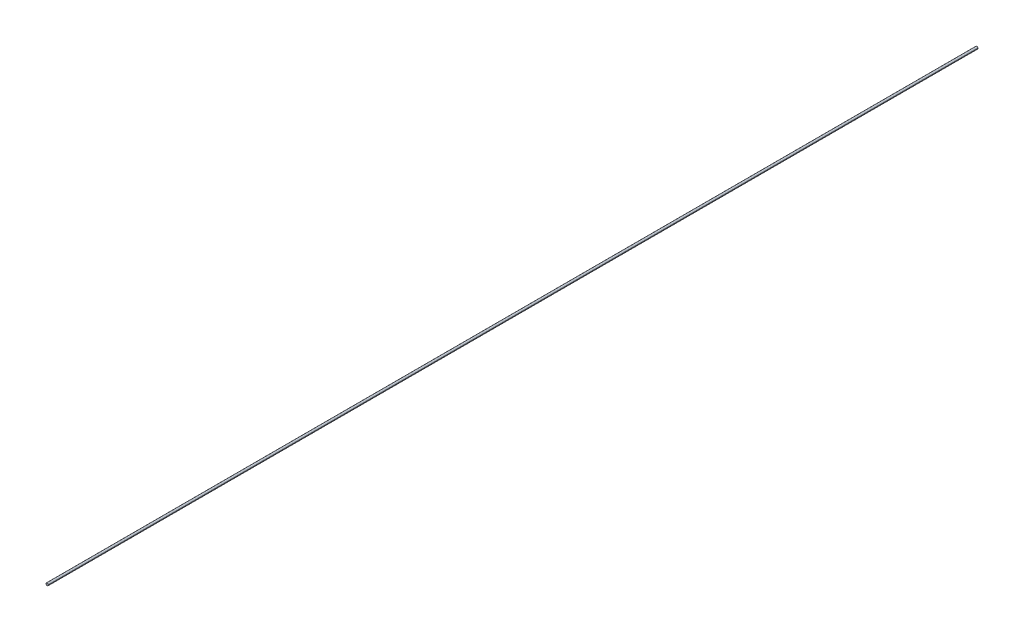
ISO-10303-21;
HEADER;
FILE_DESCRIPTION(('STEP AP214'),'2;1');
FILE_NAME('part.step','',(''),(''),'','','');
FILE_SCHEMA(('AUTOMOTIVE_DESIGN { 1 0 10303 214 1 1 1 1 }'));
ENDSEC;
DATA;
#1=APPLICATION_CONTEXT('core data for automotive mechanical design processes');
#2=APPLICATION_PROTOCOL_DEFINITION('international standard','automotive_design',2000,#1);
#3=PRODUCT_CONTEXT('',#1,'mechanical');
#4=PRODUCT('Part','Part','',(#3));
#5=PRODUCT_RELATED_PRODUCT_CATEGORY('part','',(#4));
#6=PRODUCT_DEFINITION_FORMATION('','',#4);
#7=PRODUCT_DEFINITION_CONTEXT('part definition',#1,'design');
#8=PRODUCT_DEFINITION('design','',#6,#7);
#9=PRODUCT_DEFINITION_SHAPE('','',#8);
#10=(LENGTH_UNIT() NAMED_UNIT(*) SI_UNIT(.MILLI.,.METRE.));
#11=(NAMED_UNIT(*) PLANE_ANGLE_UNIT() SI_UNIT($,.RADIAN.));
#12=(NAMED_UNIT(*) SI_UNIT($,.STERADIAN.) SOLID_ANGLE_UNIT());
#13=UNCERTAINTY_MEASURE_WITH_UNIT(LENGTH_MEASURE(1.E-05),#10,'distance_accuracy_value','');
#14=(GEOMETRIC_REPRESENTATION_CONTEXT(3) GLOBAL_UNCERTAINTY_ASSIGNED_CONTEXT((#13)) GLOBAL_UNIT_ASSIGNED_CONTEXT((#10,
#11,#12)) REPRESENTATION_CONTEXT('',''));
#15=CARTESIAN_POINT('',(0.,0.,0.));
#16=DIRECTION('',(0.,0.,1.));
#17=DIRECTION('',(1.,0.,0.));
#18=AXIS2_PLACEMENT_3D('',#15,#16,#17);
#19=CARTESIAN_POINT('',(0.,0.,15000.));
#20=DIRECTION('',(0.,0.,-1.));
#21=DIRECTION('',(-1.,0.,0.));
#22=AXIS2_PLACEMENT_3D('',#19,#20,#21);
#23=CYLINDRICAL_SURFACE('',#22,19.05);
#24=CARTESIAN_POINT('',(0.,0.,0.));
#25=DIRECTION('',(0.,0.,1.));
#26=DIRECTION('',(1.,0.,0.));
#27=AXIS2_PLACEMENT_3D('',#24,#25,#26);
#28=CIRCLE('',#27,19.05);
#29=CARTESIAN_POINT('',(19.0479994163748,0.276076499879707,0.));
#30=VERTEX_POINT('',#29);
#31=CARTESIAN_POINT('',(-19.0479994163748,0.276076499879707,0.));
#32=VERTEX_POINT('',#31);
#33=EDGE_CURVE('E40',#30,#32,#28,.T.);
#34=ORIENTED_EDGE('',*,*,#33,.T.);
#35=DIRECTION('',(0.,0.,-1.));
#36=VECTOR('',#35,1.);
#37=CARTESIAN_POINT('',(-19.0479994163748,0.276076499879707,15000.));
#38=LINE('',#37,#36);
#39=CARTESIAN_POINT('',(-19.0479994163748,0.276076499879707,15000.));
#40=VERTEX_POINT('',#39);
#41=EDGE_CURVE('E133',#32,#40,#38,.F.);
#42=ORIENTED_EDGE('',*,*,#41,.T.);
#43=CARTESIAN_POINT('',(0.,0.,15000.));
#44=DIRECTION('',(0.,0.,1.));
#45=DIRECTION('',(1.,0.,0.));
#46=AXIS2_PLACEMENT_3D('',#43,#44,#45);
#47=CIRCLE('',#46,19.05);
#48=CARTESIAN_POINT('',(19.0479994163748,0.276076499879707,15000.));
#49=VERTEX_POINT('',#48);
#50=EDGE_CURVE('E11',#49,#40,#47,.T.);
#51=ORIENTED_EDGE('',*,*,#50,.F.);
#52=DIRECTION('',(0.,0.,-1.));
#53=VECTOR('',#52,1.);
#54=CARTESIAN_POINT('',(19.0479994163748,0.276076499879707,15000.));
#55=LINE('',#54,#53);
#56=EDGE_CURVE('E158',#49,#30,#55,.T.);
#57=ORIENTED_EDGE('',*,*,#56,.T.);
#58=EDGE_LOOP('',(#34,#42,#51,#57));
#59=FACE_BOUND('',#58,.T.);
#60=ADVANCED_FACE('F36',(#59),#23,.T.);
#61=CARTESIAN_POINT('',(-19.0479994163748,-0.276076499879707,15000.));
#62=VERTEX_POINT('',#61);
#63=CARTESIAN_POINT('',(19.0479994163748,-0.276076499879707,15000.));
#64=VERTEX_POINT('',#63);
#65=EDGE_CURVE('E45',#62,#64,#47,.T.);
#66=ORIENTED_EDGE('',*,*,#65,.F.);
#67=DIRECTION('',(0.,0.,-1.));
#68=VECTOR('',#67,1.);
#69=CARTESIAN_POINT('',(-19.0479994163748,-0.276076499879707,15000.));
#70=LINE('',#69,#68);
#71=CARTESIAN_POINT('',(-19.0479994163748,-0.276076499879707,0.));
#72=VERTEX_POINT('',#71);
#73=EDGE_CURVE('E131',#62,#72,#70,.T.);
#74=ORIENTED_EDGE('',*,*,#73,.T.);
#75=CARTESIAN_POINT('',(19.0479994163748,-0.276076499879707,0.));
#76=VERTEX_POINT('',#75);
#77=EDGE_CURVE('E107',#72,#76,#28,.T.);
#78=ORIENTED_EDGE('',*,*,#77,.T.);
#79=DIRECTION('',(0.,0.,-1.));
#80=VECTOR('',#79,1.);
#81=CARTESIAN_POINT('',(19.0479994163748,-0.276076499879707,15000.));
#82=LINE('',#81,#80);
#83=EDGE_CURVE('E148',#76,#64,#82,.F.);
#84=ORIENTED_EDGE('',*,*,#83,.T.);
#85=EDGE_LOOP('',(#66,#74,#78,#84));
#86=FACE_BOUND('',#85,.T.);
#87=ADVANCED_FACE('F38',(#86),#23,.T.);
#88=CARTESIAN_POINT('',(0.,0.,15000.));
#89=DIRECTION('',(0.,0.,1.));
#90=DIRECTION('',(1.,0.,0.));
#91=AXIS2_PLACEMENT_3D('',#88,#89,#90);
#92=PLANE('',#91);
#93=ORIENTED_EDGE('',*,*,#50,.T.);
#94=DIRECTION('',(1.,0.,0.));
#95=VECTOR('',#94,1.);
#96=CARTESIAN_POINT('',(-18.782366180245,0.276076499879707,15000.));
#97=LINE('',#96,#95);
#98=CARTESIAN_POINT('',(-19.317633819755,0.276076499879707,15000.));
#99=VERTEX_POINT('',#98);
#100=EDGE_CURVE('E108',#99,#40,#97,.T.);
#101=ORIENTED_EDGE('',*,*,#100,.F.);
#102=DIRECTION('',(0.,1.,0.));
#103=VECTOR('',#102,1.);
#104=CARTESIAN_POINT('',(-19.317633819755,-0.276076499879707,15000.));
#105=LINE('',#104,#103);
#106=CARTESIAN_POINT('',(-19.317633819755,-0.276076499879707,15000.));
#107=VERTEX_POINT('',#106);
#108=EDGE_CURVE('E118',#107,#99,#105,.T.);
#109=ORIENTED_EDGE('',*,*,#108,.F.);
#110=DIRECTION('',(-1.,0.,0.));
#111=VECTOR('',#110,1.);
#112=CARTESIAN_POINT('',(-18.782366180245,-0.276076499879707,15000.));
#113=LINE('',#112,#111);
#114=EDGE_CURVE('E114',#62,#107,#113,.T.);
#115=ORIENTED_EDGE('',*,*,#114,.F.);
#116=ORIENTED_EDGE('',*,*,#65,.T.);
#117=DIRECTION('',(-1.,0.,0.));
#118=VECTOR('',#117,1.);
#119=CARTESIAN_POINT('',(19.3461046099064,-0.276076499879707,15000.));
#120=LINE('',#119,#118);
#121=CARTESIAN_POINT('',(19.3461046099064,-0.276076499879707,15000.));
#122=VERTEX_POINT('',#121);
#123=EDGE_CURVE('E146',#122,#64,#120,.T.);
#124=ORIENTED_EDGE('',*,*,#123,.F.);
#125=DIRECTION('',(0.,-1.,0.));
#126=VECTOR('',#125,1.);
#127=CARTESIAN_POINT('',(19.3461046099064,-0.276076499879707,15000.));
#128=LINE('',#127,#126);
#129=CARTESIAN_POINT('',(19.3461046099064,0.276076499879707,15000.));
#130=VERTEX_POINT('',#129);
#131=EDGE_CURVE('E150',#130,#122,#128,.T.);
#132=ORIENTED_EDGE('',*,*,#131,.F.);
#133=DIRECTION('',(1.,0.,0.));
#134=VECTOR('',#133,1.);
#135=CARTESIAN_POINT('',(19.3461046099064,0.276076499879707,15000.));
#136=LINE('',#135,#134);
#137=EDGE_CURVE('E139',#49,#130,#136,.T.);
#138=ORIENTED_EDGE('',*,*,#137,.F.);
#139=EDGE_LOOP('',(#93,#101,#109,#115,#116,#124,#132,#138));
#140=FACE_BOUND('',#139,.T.);
#141=ADVANCED_FACE('F168',(#140),#92,.T.);
#142=CARTESIAN_POINT('',(0.,0.,0.));
#143=DIRECTION('',(0.,0.,1.));
#144=DIRECTION('',(1.,0.,0.));
#145=AXIS2_PLACEMENT_3D('',#142,#143,#144);
#146=PLANE('',#145);
#147=ORIENTED_EDGE('',*,*,#77,.F.);
#148=DIRECTION('',(-1.,0.,0.));
#149=VECTOR('',#148,1.);
#150=CARTESIAN_POINT('',(-18.782366180245,-0.276076499879707,0.));
#151=LINE('',#150,#149);
#152=CARTESIAN_POINT('',(-19.317633819755,-0.276076499879707,0.));
#153=VERTEX_POINT('',#152);
#154=EDGE_CURVE('E52',#72,#153,#151,.T.);
#155=ORIENTED_EDGE('',*,*,#154,.T.);
#156=DIRECTION('',(0.,1.,0.));
#157=VECTOR('',#156,1.);
#158=CARTESIAN_POINT('',(-19.317633819755,-0.276076499879707,0.));
#159=LINE('',#158,#157);
#160=CARTESIAN_POINT('',(-19.317633819755,0.276076499879707,0.));
#161=VERTEX_POINT('',#160);
#162=EDGE_CURVE('E105',#153,#161,#159,.T.);
#163=ORIENTED_EDGE('',*,*,#162,.T.);
#164=DIRECTION('',(1.,0.,0.));
#165=VECTOR('',#164,1.);
#166=CARTESIAN_POINT('',(-18.782366180245,0.276076499879707,0.));
#167=LINE('',#166,#165);
#168=EDGE_CURVE('E109',#161,#32,#167,.T.);
#169=ORIENTED_EDGE('',*,*,#168,.T.);
#170=ORIENTED_EDGE('',*,*,#33,.F.);
#171=DIRECTION('',(1.,0.,0.));
#172=VECTOR('',#171,1.);
#173=CARTESIAN_POINT('',(19.3461046099064,0.276076499879707,0.));
#174=LINE('',#173,#172);
#175=CARTESIAN_POINT('',(19.3461046099064,0.276076499879707,0.));
#176=VERTEX_POINT('',#175);
#177=EDGE_CURVE('E136',#30,#176,#174,.T.);
#178=ORIENTED_EDGE('',*,*,#177,.T.);
#179=DIRECTION('',(0.,-1.,0.));
#180=VECTOR('',#179,1.);
#181=CARTESIAN_POINT('',(19.3461046099064,-0.276076499879707,0.));
#182=LINE('',#181,#180);
#183=CARTESIAN_POINT('',(19.3461046099064,-0.276076499879707,0.));
#184=VERTEX_POINT('',#183);
#185=EDGE_CURVE('E140',#176,#184,#182,.T.);
#186=ORIENTED_EDGE('',*,*,#185,.T.);
#187=DIRECTION('',(-1.,0.,0.));
#188=VECTOR('',#187,1.);
#189=CARTESIAN_POINT('',(19.3461046099064,-0.276076499879707,0.));
#190=LINE('',#189,#188);
#191=EDGE_CURVE('E137',#184,#76,#190,.T.);
#192=ORIENTED_EDGE('',*,*,#191,.T.);
#193=EDGE_LOOP('',(#147,#155,#163,#169,#170,#178,#186,#192));
#194=FACE_BOUND('',#193,.T.);
#195=ADVANCED_FACE('F102',(#194),#146,.F.);
#196=CARTESIAN_POINT('',(19.3461046099064,0.276076499879707,15000.8096818481));
#197=DIRECTION('',(0.,1.,0.));
#198=DIRECTION('',(0.,0.,1.));
#199=AXIS2_PLACEMENT_3D('',#196,#197,#198);
#200=PLANE('',#199);
#201=ORIENTED_EDGE('',*,*,#56,.F.);
#202=ORIENTED_EDGE('',*,*,#137,.T.);
#203=DIRECTION('',(0.,0.,-1.));
#204=VECTOR('',#203,1.);
#205=CARTESIAN_POINT('',(19.3461046099064,0.276076499879707,15000.8096818481));
#206=LINE('',#205,#204);
#207=EDGE_CURVE('E145',#130,#176,#206,.T.);
#208=ORIENTED_EDGE('',*,*,#207,.T.);
#209=ORIENTED_EDGE('',*,*,#177,.F.);
#210=EDGE_LOOP('',(#201,#202,#208,#209));
#211=FACE_BOUND('',#210,.T.);
#212=ADVANCED_FACE('F173',(#211),#200,.T.);
#213=CARTESIAN_POINT('',(19.3461046099064,-0.276076499879707,15000.8096818481));
#214=DIRECTION('',(0.,-1.,0.));
#215=DIRECTION('',(0.,0.,-1.));
#216=AXIS2_PLACEMENT_3D('',#213,#214,#215);
#217=PLANE('',#216);
#218=ORIENTED_EDGE('',*,*,#83,.F.);
#219=ORIENTED_EDGE('',*,*,#191,.F.);
#220=DIRECTION('',(0.,0.,-1.));
#221=VECTOR('',#220,1.);
#222=CARTESIAN_POINT('',(19.3461046099064,-0.276076499879707,15000.8096818481));
#223=LINE('',#222,#221);
#224=EDGE_CURVE('E149',#122,#184,#223,.T.);
#225=ORIENTED_EDGE('',*,*,#224,.F.);
#226=ORIENTED_EDGE('',*,*,#123,.T.);
#227=EDGE_LOOP('',(#218,#219,#225,#226));
#228=FACE_BOUND('',#227,.T.);
#229=ADVANCED_FACE('F180',(#228),#217,.T.);
#230=CARTESIAN_POINT('',(19.3461046099064,-0.276076499879707,15000.8096818481));
#231=DIRECTION('',(1.,0.,0.));
#232=DIRECTION('',(0.,0.,-1.));
#233=AXIS2_PLACEMENT_3D('',#230,#231,#232);
#234=PLANE('',#233);
#235=ORIENTED_EDGE('',*,*,#207,.F.);
#236=ORIENTED_EDGE('',*,*,#131,.T.);
#237=ORIENTED_EDGE('',*,*,#224,.T.);
#238=ORIENTED_EDGE('',*,*,#185,.F.);
#239=EDGE_LOOP('',(#235,#236,#237,#238));
#240=FACE_BOUND('',#239,.T.);
#241=ADVANCED_FACE('F176',(#240),#234,.T.);
#242=CARTESIAN_POINT('',(-18.782366180245,0.276076499879707,15000.7690152021));
#243=DIRECTION('',(0.,1.,0.));
#244=DIRECTION('',(0.,0.,1.));
#245=AXIS2_PLACEMENT_3D('',#242,#243,#244);
#246=PLANE('',#245);
#247=ORIENTED_EDGE('',*,*,#41,.F.);
#248=ORIENTED_EDGE('',*,*,#168,.F.);
#249=DIRECTION('',(0.,0.,-1.));
#250=VECTOR('',#249,1.);
#251=CARTESIAN_POINT('',(-19.317633819755,0.276076499879707,15000.7690152021));
#252=LINE('',#251,#250);
#253=EDGE_CURVE('E122',#99,#161,#252,.T.);
#254=ORIENTED_EDGE('',*,*,#253,.F.);
#255=ORIENTED_EDGE('',*,*,#100,.T.);
#256=EDGE_LOOP('',(#247,#248,#254,#255));
#257=FACE_BOUND('',#256,.T.);
#258=ADVANCED_FACE('F167',(#257),#246,.T.);
#259=CARTESIAN_POINT('',(-18.782366180245,-0.276076499879707,15000.7690152021));
#260=DIRECTION('',(0.,-1.,0.));
#261=DIRECTION('',(0.,0.,-1.));
#262=AXIS2_PLACEMENT_3D('',#259,#260,#261);
#263=PLANE('',#262);
#264=ORIENTED_EDGE('',*,*,#73,.F.);
#265=ORIENTED_EDGE('',*,*,#114,.T.);
#266=DIRECTION('',(0.,0.,-1.));
#267=VECTOR('',#266,1.);
#268=CARTESIAN_POINT('',(-19.317633819755,-0.276076499879707,15000.7690152021));
#269=LINE('',#268,#267);
#270=EDGE_CURVE('E112',#107,#153,#269,.T.);
#271=ORIENTED_EDGE('',*,*,#270,.T.);
#272=ORIENTED_EDGE('',*,*,#154,.F.);
#273=EDGE_LOOP('',(#264,#265,#271,#272));
#274=FACE_BOUND('',#273,.T.);
#275=ADVANCED_FACE('F113',(#274),#263,.T.);
#276=CARTESIAN_POINT('',(-19.317633819755,-0.276076499879707,15000.7690152021));
#277=DIRECTION('',(-1.,0.,0.));
#278=DIRECTION('',(0.,0.,1.));
#279=AXIS2_PLACEMENT_3D('',#276,#277,#278);
#280=PLANE('',#279);
#281=ORIENTED_EDGE('',*,*,#270,.F.);
#282=ORIENTED_EDGE('',*,*,#108,.T.);
#283=ORIENTED_EDGE('',*,*,#253,.T.);
#284=ORIENTED_EDGE('',*,*,#162,.F.);
#285=EDGE_LOOP('',(#281,#282,#283,#284));
#286=FACE_BOUND('',#285,.T.);
#287=ADVANCED_FACE('F120',(#286),#280,.T.);
#288=CLOSED_SHELL('',(#60,#87,#141,#195,#212,#229,#241,#258,#275,#287));
#289=MANIFOLD_SOLID_BREP('B2',#288);
#290=ADVANCED_BREP_SHAPE_REPRESENTATION('',(#18,#289),#14);
#291=SHAPE_DEFINITION_REPRESENTATION(#9,#290);
ENDSEC;
END-ISO-10303-21;
